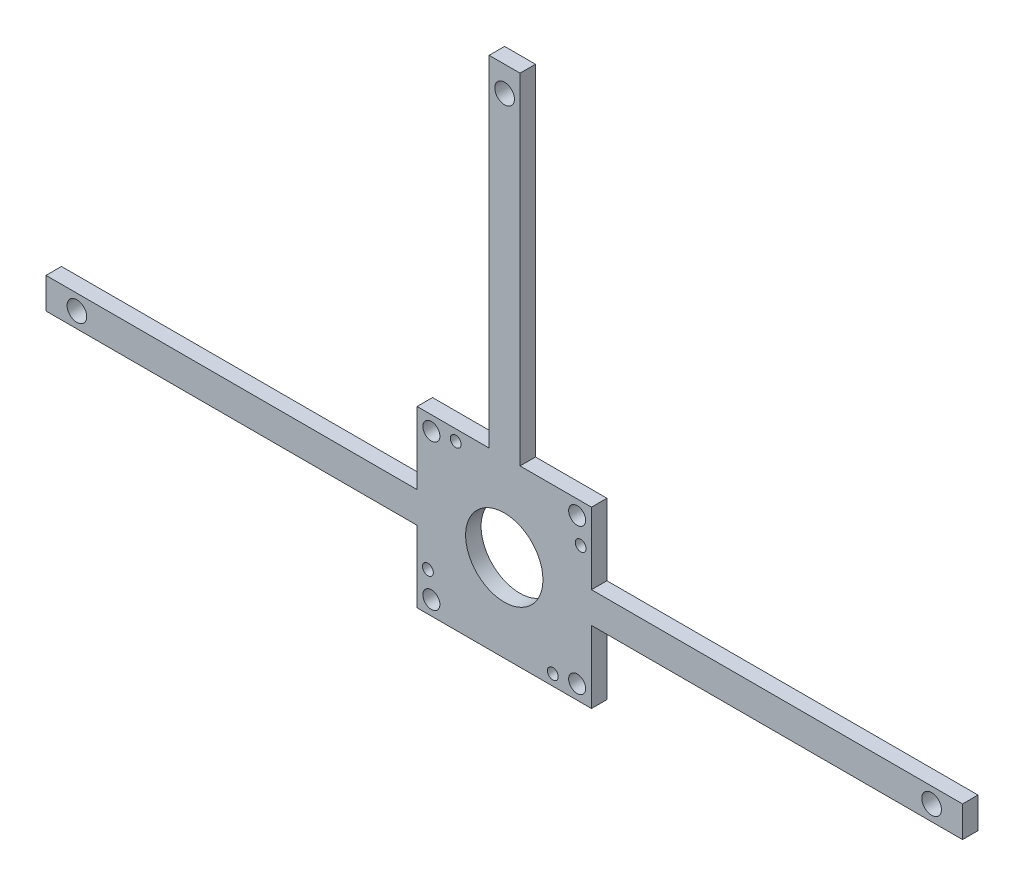
ISO-10303-21;
HEADER;
FILE_DESCRIPTION(('STEP AP214'),'2;1');
FILE_NAME('part.step','',(''),(''),'','','');
FILE_SCHEMA(('AUTOMOTIVE_DESIGN { 1 0 10303 214 1 1 1 1 }'));
ENDSEC;
DATA;
#1=APPLICATION_CONTEXT('core data for automotive mechanical design processes');
#2=APPLICATION_PROTOCOL_DEFINITION('international standard','automotive_design',2000,#1);
#3=PRODUCT_CONTEXT('',#1,'mechanical');
#4=PRODUCT('Part','Part','',(#3));
#5=PRODUCT_RELATED_PRODUCT_CATEGORY('part','',(#4));
#6=PRODUCT_DEFINITION_FORMATION('','',#4);
#7=PRODUCT_DEFINITION_CONTEXT('part definition',#1,'design');
#8=PRODUCT_DEFINITION('design','',#6,#7);
#9=PRODUCT_DEFINITION_SHAPE('','',#8);
#10=(LENGTH_UNIT() NAMED_UNIT(*) SI_UNIT(.MILLI.,.METRE.));
#11=(NAMED_UNIT(*) PLANE_ANGLE_UNIT() SI_UNIT($,.RADIAN.));
#12=(NAMED_UNIT(*) SI_UNIT($,.STERADIAN.) SOLID_ANGLE_UNIT());
#13=UNCERTAINTY_MEASURE_WITH_UNIT(LENGTH_MEASURE(1.E-05),#10,'distance_accuracy_value','');
#14=(GEOMETRIC_REPRESENTATION_CONTEXT(3) GLOBAL_UNCERTAINTY_ASSIGNED_CONTEXT((#13)) GLOBAL_UNIT_ASSIGNED_CONTEXT((#10,
#11,#12)) REPRESENTATION_CONTEXT('',''));
#15=CARTESIAN_POINT('',(0.,0.,0.));
#16=DIRECTION('',(0.,0.,1.));
#17=DIRECTION('',(1.,0.,0.));
#18=AXIS2_PLACEMENT_3D('',#15,#16,#17);
#19=CARTESIAN_POINT('',(0.,0.,5.));
#20=DIRECTION('',(0.,0.,1.));
#21=DIRECTION('',(1.,0.,0.));
#22=AXIS2_PLACEMENT_3D('',#19,#20,#21);
#23=PLANE('',#22);
#24=CARTESIAN_POINT('',(0.101590295881258,70.,5.));
#25=DIRECTION('',(0.,0.,1.));
#26=DIRECTION('',(1.,0.,0.));
#27=AXIS2_PLACEMENT_3D('',#24,#25,#26);
#28=CIRCLE('',#27,3.175);
#29=CARTESIAN_POINT('',(3.27659029588126,70.,5.));
#30=VERTEX_POINT('',#29);
#31=EDGE_CURVE('E370',#30,#30,#28,.T.);
#32=ORIENTED_EDGE('',*,*,#31,.F.);
#33=EDGE_LOOP('',(#32));
#34=FACE_BOUND('',#33,.T.);
#35=CARTESIAN_POINT('',(0.,-60.,5.));
#36=DIRECTION('',(0.,0.,1.));
#37=DIRECTION('',(1.,0.,0.));
#38=AXIS2_PLACEMENT_3D('',#35,#36,#37);
#39=CIRCLE('',#38,12.5);
#40=CARTESIAN_POINT('',(12.5,-60.,5.));
#41=VERTEX_POINT('',#40);
#42=EDGE_CURVE('E383',#41,#41,#39,.T.);
#43=ORIENTED_EDGE('',*,*,#42,.F.);
#44=EDGE_LOOP('',(#43));
#45=FACE_BOUND('',#44,.T.);
#46=CARTESIAN_POINT('',(-138.2,-60.0834875289985,5.));
#47=DIRECTION('',(0.,0.,1.));
#48=DIRECTION('',(1.,0.,0.));
#49=AXIS2_PLACEMENT_3D('',#46,#47,#48);
#50=CIRCLE('',#49,3.175);
#51=CARTESIAN_POINT('',(-135.025,-60.0834875289985,5.));
#52=VERTEX_POINT('',#51);
#53=EDGE_CURVE('E382',#52,#52,#50,.T.);
#54=ORIENTED_EDGE('',*,*,#53,.F.);
#55=EDGE_LOOP('',(#54));
#56=FACE_BOUND('',#55,.T.);
#57=CARTESIAN_POINT('',(138.2,-59.9165124710015,5.));
#58=DIRECTION('',(0.,0.,1.));
#59=DIRECTION('',(1.,0.,0.));
#60=AXIS2_PLACEMENT_3D('',#57,#58,#59);
#61=CIRCLE('',#60,3.175);
#62=CARTESIAN_POINT('',(141.375,-59.9165124710015,5.));
#63=VERTEX_POINT('',#62);
#64=EDGE_CURVE('E376',#63,#63,#61,.T.);
#65=ORIENTED_EDGE('',*,*,#64,.F.);
#66=EDGE_LOOP('',(#65));
#67=FACE_BOUND('',#66,.T.);
#68=CARTESIAN_POINT('',(-24.6999999999999,-75.6999999999999,5.));
#69=DIRECTION('',(0.,0.,1.));
#70=DIRECTION('',(1.,0.,0.));
#71=AXIS2_PLACEMENT_3D('',#68,#69,#70);
#72=CIRCLE('',#71,1.74999999999999);
#73=CARTESIAN_POINT('',(-22.95,-75.6999999999999,5.));
#74=VERTEX_POINT('',#73);
#75=EDGE_CURVE('E393',#74,#74,#72,.T.);
#76=ORIENTED_EDGE('',*,*,#75,.F.);
#77=EDGE_LOOP('',(#76));
#78=FACE_BOUND('',#77,.T.);
#79=CARTESIAN_POINT('',(24.6999999999999,-44.3,5.));
#80=DIRECTION('',(0.,0.,1.));
#81=DIRECTION('',(1.,0.,0.));
#82=AXIS2_PLACEMENT_3D('',#79,#80,#81);
#83=CIRCLE('',#82,1.74777874746956);
#84=CARTESIAN_POINT('',(26.4477787474694,-44.3,5.));
#85=VERTEX_POINT('',#84);
#86=EDGE_CURVE('E405',#85,#85,#83,.T.);
#87=ORIENTED_EDGE('',*,*,#86,.F.);
#88=EDGE_LOOP('',(#87));
#89=FACE_BOUND('',#88,.T.);
#90=CARTESIAN_POINT('',(-23.57,-83.57,5.));
#91=DIRECTION('',(0.,0.,1.));
#92=DIRECTION('',(1.,0.,0.));
#93=AXIS2_PLACEMENT_3D('',#90,#91,#92);
#94=CIRCLE('',#93,2.75);
#95=CARTESIAN_POINT('',(-20.82,-83.57,5.));
#96=VERTEX_POINT('',#95);
#97=EDGE_CURVE('E417',#96,#96,#94,.T.);
#98=ORIENTED_EDGE('',*,*,#97,.F.);
#99=EDGE_LOOP('',(#98));
#100=FACE_BOUND('',#99,.T.);
#101=CARTESIAN_POINT('',(23.57,-36.43,5.));
#102=DIRECTION('',(0.,0.,1.));
#103=DIRECTION('',(1.,0.,0.));
#104=AXIS2_PLACEMENT_3D('',#101,#102,#103);
#105=CIRCLE('',#104,2.75);
#106=CARTESIAN_POINT('',(26.32,-36.43,5.));
#107=VERTEX_POINT('',#106);
#108=EDGE_CURVE('E429',#107,#107,#105,.T.);
#109=ORIENTED_EDGE('',*,*,#108,.F.);
#110=EDGE_LOOP('',(#109));
#111=FACE_BOUND('',#110,.T.);
#112=DIRECTION('',(-1.,0.,0.));
#113=VECTOR('',#112,1.);
#114=CARTESIAN_POINT('',(5.10159029588126,-31.8,5.));
#115=LINE('',#114,#113);
#116=CARTESIAN_POINT('',(28.2,-31.8,5.));
#117=VERTEX_POINT('',#116);
#118=CARTESIAN_POINT('',(5.10159029588126,-31.8,5.));
#119=VERTEX_POINT('',#118);
#120=EDGE_CURVE('E210',#117,#119,#115,.T.);
#121=ORIENTED_EDGE('',*,*,#120,.T.);
#122=DIRECTION('',(0.,1.,0.));
#123=VECTOR('',#122,1.);
#124=CARTESIAN_POINT('',(5.10159029588126,-31.8,5.));
#125=LINE('',#124,#123);
#126=CARTESIAN_POINT('',(5.10159029588126,78.2,5.));
#127=VERTEX_POINT('',#126);
#128=EDGE_CURVE('E118',#119,#127,#125,.T.);
#129=ORIENTED_EDGE('',*,*,#128,.T.);
#130=DIRECTION('',(-1.,0.,0.));
#131=VECTOR('',#130,1.);
#132=CARTESIAN_POINT('',(5.10159029588126,78.2,5.));
#133=LINE('',#132,#131);
#134=CARTESIAN_POINT('',(-4.89840970411874,78.2,5.));
#135=VERTEX_POINT('',#134);
#136=EDGE_CURVE('E249',#127,#135,#133,.T.);
#137=ORIENTED_EDGE('',*,*,#136,.T.);
#138=DIRECTION('',(0.,-1.,0.));
#139=VECTOR('',#138,1.);
#140=CARTESIAN_POINT('',(-4.89840970411874,-31.8,5.));
#141=LINE('',#140,#139);
#142=CARTESIAN_POINT('',(-4.89840970411874,-31.8,5.));
#143=VERTEX_POINT('',#142);
#144=EDGE_CURVE('E268',#135,#143,#141,.T.);
#145=ORIENTED_EDGE('',*,*,#144,.T.);
#146=DIRECTION('',(-1.,0.,0.));
#147=VECTOR('',#146,1.);
#148=CARTESIAN_POINT('',(-28.2,-31.8,5.));
#149=LINE('',#148,#147);
#150=CARTESIAN_POINT('',(-28.2,-31.8,5.));
#151=VERTEX_POINT('',#150);
#152=EDGE_CURVE('E265',#143,#151,#149,.T.);
#153=ORIENTED_EDGE('',*,*,#152,.T.);
#154=DIRECTION('',(0.,-1.,0.));
#155=VECTOR('',#154,1.);
#156=CARTESIAN_POINT('',(-28.2,-55.0834875289985,5.));
#157=LINE('',#156,#155);
#158=CARTESIAN_POINT('',(-28.2,-55.0834875289985,5.));
#159=VERTEX_POINT('',#158);
#160=EDGE_CURVE('E267',#151,#159,#157,.T.);
#161=ORIENTED_EDGE('',*,*,#160,.T.);
#162=DIRECTION('',(-1.,0.,0.));
#163=VECTOR('',#162,1.);
#164=CARTESIAN_POINT('',(-148.2,-55.0834875289985,5.));
#165=LINE('',#164,#163);
#166=CARTESIAN_POINT('',(-148.2,-55.0834875289985,5.));
#167=VERTEX_POINT('',#166);
#168=EDGE_CURVE('E270',#159,#167,#165,.T.);
#169=ORIENTED_EDGE('',*,*,#168,.T.);
#170=DIRECTION('',(0.,-1.,0.));
#171=VECTOR('',#170,1.);
#172=CARTESIAN_POINT('',(-148.2,-55.0834875289985,5.));
#173=LINE('',#172,#171);
#174=CARTESIAN_POINT('',(-148.2,-65.0834875289985,5.));
#175=VERTEX_POINT('',#174);
#176=EDGE_CURVE('E276',#167,#175,#173,.T.);
#177=ORIENTED_EDGE('',*,*,#176,.T.);
#178=DIRECTION('',(1.,0.,0.));
#179=VECTOR('',#178,1.);
#180=CARTESIAN_POINT('',(-148.2,-65.0834875289985,5.));
#181=LINE('',#180,#179);
#182=CARTESIAN_POINT('',(-28.2,-65.0834875289985,5.));
#183=VERTEX_POINT('',#182);
#184=EDGE_CURVE('E278',#175,#183,#181,.T.);
#185=ORIENTED_EDGE('',*,*,#184,.T.);
#186=DIRECTION('',(0.,-1.,0.));
#187=VECTOR('',#186,1.);
#188=CARTESIAN_POINT('',(-28.2,-88.2,5.));
#189=LINE('',#188,#187);
#190=CARTESIAN_POINT('',(-28.2,-88.2,5.));
#191=VERTEX_POINT('',#190);
#192=EDGE_CURVE('E280',#183,#191,#189,.T.);
#193=ORIENTED_EDGE('',*,*,#192,.T.);
#194=DIRECTION('',(1.,0.,0.));
#195=VECTOR('',#194,1.);
#196=CARTESIAN_POINT('',(-28.2,-88.2,5.));
#197=LINE('',#196,#195);
#198=CARTESIAN_POINT('',(28.2,-88.2,5.));
#199=VERTEX_POINT('',#198);
#200=EDGE_CURVE('E282',#191,#199,#197,.T.);
#201=ORIENTED_EDGE('',*,*,#200,.T.);
#202=DIRECTION('',(0.,1.,0.));
#203=VECTOR('',#202,1.);
#204=CARTESIAN_POINT('',(28.2,-88.2,5.));
#205=LINE('',#204,#203);
#206=CARTESIAN_POINT('',(28.2,-64.9165124710015,5.));
#207=VERTEX_POINT('',#206);
#208=EDGE_CURVE('E284',#199,#207,#205,.T.);
#209=ORIENTED_EDGE('',*,*,#208,.T.);
#210=DIRECTION('',(1.,0.,0.));
#211=VECTOR('',#210,1.);
#212=CARTESIAN_POINT('',(28.2,-64.9165124710015,5.));
#213=LINE('',#212,#211);
#214=CARTESIAN_POINT('',(148.2,-64.9165124710015,5.));
#215=VERTEX_POINT('',#214);
#216=EDGE_CURVE('E161',#207,#215,#213,.T.);
#217=ORIENTED_EDGE('',*,*,#216,.T.);
#218=DIRECTION('',(0.,1.,0.));
#219=VECTOR('',#218,1.);
#220=CARTESIAN_POINT('',(148.2,-54.9165124710015,5.));
#221=LINE('',#220,#219);
#222=CARTESIAN_POINT('',(148.2,-54.9165124710015,5.));
#223=VERTEX_POINT('',#222);
#224=EDGE_CURVE('E155',#215,#223,#221,.T.);
#225=ORIENTED_EDGE('',*,*,#224,.T.);
#226=DIRECTION('',(-1.,0.,0.));
#227=VECTOR('',#226,1.);
#228=CARTESIAN_POINT('',(28.2,-54.9165124710015,5.));
#229=LINE('',#228,#227);
#230=CARTESIAN_POINT('',(28.2,-54.9165124710015,5.));
#231=VERTEX_POINT('',#230);
#232=EDGE_CURVE('E159',#223,#231,#229,.T.);
#233=ORIENTED_EDGE('',*,*,#232,.T.);
#234=DIRECTION('',(0.,1.,0.));
#235=VECTOR('',#234,1.);
#236=CARTESIAN_POINT('',(28.2,-54.9165124710015,5.));
#237=LINE('',#236,#235);
#238=EDGE_CURVE('E51',#231,#117,#237,.T.);
#239=ORIENTED_EDGE('',*,*,#238,.T.);
#240=EDGE_LOOP('',(#121,#129,#137,#145,#153,#161,#169,#177,#185,#193,#201,#209,#217,#225,#233,#239));
#241=FACE_BOUND('',#240,.T.);
#242=CARTESIAN_POINT('',(-23.57,-36.43,5.));
#243=DIRECTION('',(0.,0.,1.));
#244=DIRECTION('',(1.,0.,0.));
#245=AXIS2_PLACEMENT_3D('',#242,#243,#244);
#246=CIRCLE('',#245,2.75);
#247=CARTESIAN_POINT('',(-20.82,-36.43,5.));
#248=VERTEX_POINT('',#247);
#249=EDGE_CURVE('E183',#248,#248,#246,.T.);
#250=ORIENTED_EDGE('',*,*,#249,.F.);
#251=EDGE_LOOP('',(#250));
#252=FACE_BOUND('',#251,.T.);
#253=CARTESIAN_POINT('',(23.57,-83.57,5.));
#254=DIRECTION('',(0.,0.,1.));
#255=DIRECTION('',(1.,0.,0.));
#256=AXIS2_PLACEMENT_3D('',#253,#254,#255);
#257=CIRCLE('',#256,2.75);
#258=CARTESIAN_POINT('',(26.32,-83.57,5.));
#259=VERTEX_POINT('',#258);
#260=EDGE_CURVE('E423',#259,#259,#257,.T.);
#261=ORIENTED_EDGE('',*,*,#260,.F.);
#262=EDGE_LOOP('',(#261));
#263=FACE_BOUND('',#262,.T.);
#264=CARTESIAN_POINT('',(-15.7,-35.3,5.));
#265=DIRECTION('',(0.,0.,1.));
#266=DIRECTION('',(1.,0.,0.));
#267=AXIS2_PLACEMENT_3D('',#264,#265,#266);
#268=CIRCLE('',#267,1.74999999999999);
#269=CARTESIAN_POINT('',(-13.95,-35.3,5.));
#270=VERTEX_POINT('',#269);
#271=EDGE_CURVE('E411',#270,#270,#268,.T.);
#272=ORIENTED_EDGE('',*,*,#271,.F.);
#273=EDGE_LOOP('',(#272));
#274=FACE_BOUND('',#273,.T.);
#275=CARTESIAN_POINT('',(15.6999999999999,-84.6999999999998,5.));
#276=DIRECTION('',(0.,0.,1.));
#277=DIRECTION('',(1.,0.,0.));
#278=AXIS2_PLACEMENT_3D('',#275,#276,#277);
#279=CIRCLE('',#278,1.74999999999999);
#280=CARTESIAN_POINT('',(17.4499999999999,-84.6999999999998,5.));
#281=VERTEX_POINT('',#280);
#282=EDGE_CURVE('E399',#281,#281,#279,.T.);
#283=ORIENTED_EDGE('',*,*,#282,.F.);
#284=EDGE_LOOP('',(#283));
#285=FACE_BOUND('',#284,.T.);
#286=ADVANCED_FACE('F34',(#34,#45,#56,#67,#78,#89,#100,#111,#241,#252,#263,#274,#285),#23,.T.);
#287=CARTESIAN_POINT('',(0.,0.,0.));
#288=DIRECTION('',(0.,0.,1.));
#289=DIRECTION('',(1.,0.,0.));
#290=AXIS2_PLACEMENT_3D('',#287,#288,#289);
#291=PLANE('',#290);
#292=CARTESIAN_POINT('',(0.101590295881258,70.,0.));
#293=DIRECTION('',(0.,0.,1.));
#294=DIRECTION('',(1.,0.,0.));
#295=AXIS2_PLACEMENT_3D('',#292,#293,#294);
#296=CIRCLE('',#295,3.175);
#297=CARTESIAN_POINT('',(3.27659029588126,70.,0.));
#298=VERTEX_POINT('',#297);
#299=EDGE_CURVE('E368',#298,#298,#296,.T.);
#300=ORIENTED_EDGE('',*,*,#299,.T.);
#301=EDGE_LOOP('',(#300));
#302=FACE_BOUND('',#301,.T.);
#303=CARTESIAN_POINT('',(0.,-60.,0.));
#304=DIRECTION('',(0.,0.,1.));
#305=DIRECTION('',(1.,0.,0.));
#306=AXIS2_PLACEMENT_3D('',#303,#304,#305);
#307=CIRCLE('',#306,12.5);
#308=CARTESIAN_POINT('',(12.5,-60.,0.));
#309=VERTEX_POINT('',#308);
#310=EDGE_CURVE('E379',#309,#309,#307,.T.);
#311=ORIENTED_EDGE('',*,*,#310,.T.);
#312=EDGE_LOOP('',(#311));
#313=FACE_BOUND('',#312,.T.);
#314=CARTESIAN_POINT('',(-138.2,-60.0834875289985,0.));
#315=DIRECTION('',(0.,0.,1.));
#316=DIRECTION('',(1.,0.,0.));
#317=AXIS2_PLACEMENT_3D('',#314,#315,#316);
#318=CIRCLE('',#317,3.175);
#319=CARTESIAN_POINT('',(-135.025,-60.0834875289985,0.));
#320=VERTEX_POINT('',#319);
#321=EDGE_CURVE('E388',#320,#320,#318,.T.);
#322=ORIENTED_EDGE('',*,*,#321,.T.);
#323=EDGE_LOOP('',(#322));
#324=FACE_BOUND('',#323,.T.);
#325=CARTESIAN_POINT('',(138.2,-59.9165124710015,0.));
#326=DIRECTION('',(0.,0.,1.));
#327=DIRECTION('',(1.,0.,0.));
#328=AXIS2_PLACEMENT_3D('',#325,#326,#327);
#329=CIRCLE('',#328,3.175);
#330=CARTESIAN_POINT('',(141.375,-59.9165124710015,0.));
#331=VERTEX_POINT('',#330);
#332=EDGE_CURVE('E371',#331,#331,#329,.T.);
#333=ORIENTED_EDGE('',*,*,#332,.T.);
#334=EDGE_LOOP('',(#333));
#335=FACE_BOUND('',#334,.T.);
#336=DIRECTION('',(-1.,0.,0.));
#337=VECTOR('',#336,1.);
#338=CARTESIAN_POINT('',(5.10159029588126,-31.8,0.));
#339=LINE('',#338,#337);
#340=CARTESIAN_POINT('',(28.2,-31.8,0.));
#341=VERTEX_POINT('',#340);
#342=CARTESIAN_POINT('',(5.10159029588126,-31.8,0.));
#343=VERTEX_POINT('',#342);
#344=EDGE_CURVE('E179',#341,#343,#339,.T.);
#345=ORIENTED_EDGE('',*,*,#344,.F.);
#346=DIRECTION('',(0.,1.,0.));
#347=VECTOR('',#346,1.);
#348=CARTESIAN_POINT('',(28.2,-54.9165124710015,0.));
#349=LINE('',#348,#347);
#350=CARTESIAN_POINT('',(28.2,-54.9165124710015,0.));
#351=VERTEX_POINT('',#350);
#352=EDGE_CURVE('E110',#351,#341,#349,.T.);
#353=ORIENTED_EDGE('',*,*,#352,.F.);
#354=DIRECTION('',(-1.,0.,0.));
#355=VECTOR('',#354,1.);
#356=CARTESIAN_POINT('',(28.2,-54.9165124710015,0.));
#357=LINE('',#356,#355);
#358=CARTESIAN_POINT('',(148.2,-54.9165124710015,0.));
#359=VERTEX_POINT('',#358);
#360=EDGE_CURVE('E104',#359,#351,#357,.T.);
#361=ORIENTED_EDGE('',*,*,#360,.F.);
#362=DIRECTION('',(0.,1.,0.));
#363=VECTOR('',#362,1.);
#364=CARTESIAN_POINT('',(148.2,-54.9165124710015,0.));
#365=LINE('',#364,#363);
#366=CARTESIAN_POINT('',(148.2,-64.9165124710015,0.));
#367=VERTEX_POINT('',#366);
#368=EDGE_CURVE('E169',#367,#359,#365,.T.);
#369=ORIENTED_EDGE('',*,*,#368,.F.);
#370=DIRECTION('',(1.,0.,0.));
#371=VECTOR('',#370,1.);
#372=CARTESIAN_POINT('',(28.2,-64.9165124710015,0.));
#373=LINE('',#372,#371);
#374=CARTESIAN_POINT('',(28.2,-64.9165124710015,0.));
#375=VERTEX_POINT('',#374);
#376=EDGE_CURVE('E205',#375,#367,#373,.T.);
#377=ORIENTED_EDGE('',*,*,#376,.F.);
#378=DIRECTION('',(0.,1.,0.));
#379=VECTOR('',#378,1.);
#380=CARTESIAN_POINT('',(28.2,-88.2,0.));
#381=LINE('',#380,#379);
#382=CARTESIAN_POINT('',(28.2,-88.2,0.));
#383=VERTEX_POINT('',#382);
#384=EDGE_CURVE('E203',#383,#375,#381,.T.);
#385=ORIENTED_EDGE('',*,*,#384,.F.);
#386=DIRECTION('',(1.,0.,0.));
#387=VECTOR('',#386,1.);
#388=CARTESIAN_POINT('',(-28.2,-88.2,0.));
#389=LINE('',#388,#387);
#390=CARTESIAN_POINT('',(-28.2,-88.2,0.));
#391=VERTEX_POINT('',#390);
#392=EDGE_CURVE('E201',#391,#383,#389,.T.);
#393=ORIENTED_EDGE('',*,*,#392,.F.);
#394=DIRECTION('',(0.,-1.,0.));
#395=VECTOR('',#394,1.);
#396=CARTESIAN_POINT('',(-28.2,-88.2,0.));
#397=LINE('',#396,#395);
#398=CARTESIAN_POINT('',(-28.2,-65.0834875289985,0.));
#399=VERTEX_POINT('',#398);
#400=EDGE_CURVE('E199',#399,#391,#397,.T.);
#401=ORIENTED_EDGE('',*,*,#400,.F.);
#402=DIRECTION('',(1.,0.,0.));
#403=VECTOR('',#402,1.);
#404=CARTESIAN_POINT('',(-148.2,-65.0834875289985,0.));
#405=LINE('',#404,#403);
#406=CARTESIAN_POINT('',(-148.2,-65.0834875289985,0.));
#407=VERTEX_POINT('',#406);
#408=EDGE_CURVE('E197',#407,#399,#405,.T.);
#409=ORIENTED_EDGE('',*,*,#408,.F.);
#410=DIRECTION('',(0.,-1.,0.));
#411=VECTOR('',#410,1.);
#412=CARTESIAN_POINT('',(-148.2,-55.0834875289985,0.));
#413=LINE('',#412,#411);
#414=CARTESIAN_POINT('',(-148.2,-55.0834875289985,0.));
#415=VERTEX_POINT('',#414);
#416=EDGE_CURVE('E195',#415,#407,#413,.T.);
#417=ORIENTED_EDGE('',*,*,#416,.F.);
#418=DIRECTION('',(-1.,0.,0.));
#419=VECTOR('',#418,1.);
#420=CARTESIAN_POINT('',(-148.2,-55.0834875289985,0.));
#421=LINE('',#420,#419);
#422=CARTESIAN_POINT('',(-28.2,-55.0834875289985,0.));
#423=VERTEX_POINT('',#422);
#424=EDGE_CURVE('E193',#423,#415,#421,.T.);
#425=ORIENTED_EDGE('',*,*,#424,.F.);
#426=DIRECTION('',(0.,-1.,0.));
#427=VECTOR('',#426,1.);
#428=CARTESIAN_POINT('',(-28.2,-55.0834875289985,0.));
#429=LINE('',#428,#427);
#430=CARTESIAN_POINT('',(-28.2,-31.8,0.));
#431=VERTEX_POINT('',#430);
#432=EDGE_CURVE('E191',#431,#423,#429,.T.);
#433=ORIENTED_EDGE('',*,*,#432,.F.);
#434=DIRECTION('',(-1.,0.,0.));
#435=VECTOR('',#434,1.);
#436=CARTESIAN_POINT('',(-28.2,-31.8,0.));
#437=LINE('',#436,#435);
#438=CARTESIAN_POINT('',(-4.89840970411874,-31.8,0.));
#439=VERTEX_POINT('',#438);
#440=EDGE_CURVE('E189',#439,#431,#437,.T.);
#441=ORIENTED_EDGE('',*,*,#440,.F.);
#442=DIRECTION('',(0.,-1.,0.));
#443=VECTOR('',#442,1.);
#444=CARTESIAN_POINT('',(-4.89840970411874,-31.8,0.));
#445=LINE('',#444,#443);
#446=CARTESIAN_POINT('',(-4.89840970411874,78.2,0.));
#447=VERTEX_POINT('',#446);
#448=EDGE_CURVE('E187',#447,#439,#445,.T.);
#449=ORIENTED_EDGE('',*,*,#448,.F.);
#450=DIRECTION('',(-1.,0.,0.));
#451=VECTOR('',#450,1.);
#452=CARTESIAN_POINT('',(5.10159029588126,78.2,0.));
#453=LINE('',#452,#451);
#454=CARTESIAN_POINT('',(5.10159029588126,78.2,0.));
#455=VERTEX_POINT('',#454);
#456=EDGE_CURVE('E185',#455,#447,#453,.T.);
#457=ORIENTED_EDGE('',*,*,#456,.F.);
#458=DIRECTION('',(0.,1.,0.));
#459=VECTOR('',#458,1.);
#460=CARTESIAN_POINT('',(5.10159029588126,-31.8,0.));
#461=LINE('',#460,#459);
#462=EDGE_CURVE('E182',#343,#455,#461,.T.);
#463=ORIENTED_EDGE('',*,*,#462,.F.);
#464=EDGE_LOOP('',(#345,#353,#361,#369,#377,#385,#393,#401,#409,#417,#425,#433,#441,#449,#457,#463));
#465=FACE_BOUND('',#464,.T.);
#466=CARTESIAN_POINT('',(-23.57,-36.43,0.));
#467=DIRECTION('',(0.,0.,1.));
#468=DIRECTION('',(1.,0.,0.));
#469=AXIS2_PLACEMENT_3D('',#466,#467,#468);
#470=CIRCLE('',#469,2.75);
#471=CARTESIAN_POINT('',(-20.82,-36.43,0.));
#472=VERTEX_POINT('',#471);
#473=EDGE_CURVE('E432',#472,#472,#470,.T.);
#474=ORIENTED_EDGE('',*,*,#473,.T.);
#475=EDGE_LOOP('',(#474));
#476=FACE_BOUND('',#475,.T.);
#477=CARTESIAN_POINT('',(23.57,-36.43,0.));
#478=DIRECTION('',(0.,0.,1.));
#479=DIRECTION('',(1.,0.,0.));
#480=AXIS2_PLACEMENT_3D('',#477,#478,#479);
#481=CIRCLE('',#480,2.75);
#482=CARTESIAN_POINT('',(26.32,-36.43,0.));
#483=VERTEX_POINT('',#482);
#484=EDGE_CURVE('E426',#483,#483,#481,.T.);
#485=ORIENTED_EDGE('',*,*,#484,.T.);
#486=EDGE_LOOP('',(#485));
#487=FACE_BOUND('',#486,.T.);
#488=CARTESIAN_POINT('',(23.57,-83.57,0.));
#489=DIRECTION('',(0.,0.,1.));
#490=DIRECTION('',(1.,0.,0.));
#491=AXIS2_PLACEMENT_3D('',#488,#489,#490);
#492=CIRCLE('',#491,2.75);
#493=CARTESIAN_POINT('',(26.32,-83.57,0.));
#494=VERTEX_POINT('',#493);
#495=EDGE_CURVE('E420',#494,#494,#492,.T.);
#496=ORIENTED_EDGE('',*,*,#495,.T.);
#497=EDGE_LOOP('',(#496));
#498=FACE_BOUND('',#497,.T.);
#499=CARTESIAN_POINT('',(-23.57,-83.57,0.));
#500=DIRECTION('',(0.,0.,1.));
#501=DIRECTION('',(1.,0.,0.));
#502=AXIS2_PLACEMENT_3D('',#499,#500,#501);
#503=CIRCLE('',#502,2.75);
#504=CARTESIAN_POINT('',(-20.82,-83.57,0.));
#505=VERTEX_POINT('',#504);
#506=EDGE_CURVE('E414',#505,#505,#503,.T.);
#507=ORIENTED_EDGE('',*,*,#506,.T.);
#508=EDGE_LOOP('',(#507));
#509=FACE_BOUND('',#508,.T.);
#510=CARTESIAN_POINT('',(-15.7,-35.3,0.));
#511=DIRECTION('',(0.,0.,1.));
#512=DIRECTION('',(1.,0.,0.));
#513=AXIS2_PLACEMENT_3D('',#510,#511,#512);
#514=CIRCLE('',#513,1.74999999999999);
#515=CARTESIAN_POINT('',(-13.95,-35.3,0.));
#516=VERTEX_POINT('',#515);
#517=EDGE_CURVE('E408',#516,#516,#514,.T.);
#518=ORIENTED_EDGE('',*,*,#517,.T.);
#519=EDGE_LOOP('',(#518));
#520=FACE_BOUND('',#519,.T.);
#521=CARTESIAN_POINT('',(24.6999999999999,-44.3,0.));
#522=DIRECTION('',(0.,0.,1.));
#523=DIRECTION('',(1.,0.,0.));
#524=AXIS2_PLACEMENT_3D('',#521,#522,#523);
#525=CIRCLE('',#524,1.74777874746956);
#526=CARTESIAN_POINT('',(26.4477787474694,-44.3,0.));
#527=VERTEX_POINT('',#526);
#528=EDGE_CURVE('E402',#527,#527,#525,.T.);
#529=ORIENTED_EDGE('',*,*,#528,.T.);
#530=EDGE_LOOP('',(#529));
#531=FACE_BOUND('',#530,.T.);
#532=CARTESIAN_POINT('',(15.6999999999999,-84.6999999999998,0.));
#533=DIRECTION('',(0.,0.,1.));
#534=DIRECTION('',(1.,0.,0.));
#535=AXIS2_PLACEMENT_3D('',#532,#533,#534);
#536=CIRCLE('',#535,1.74999999999999);
#537=CARTESIAN_POINT('',(17.4499999999999,-84.6999999999998,0.));
#538=VERTEX_POINT('',#537);
#539=EDGE_CURVE('E396',#538,#538,#536,.T.);
#540=ORIENTED_EDGE('',*,*,#539,.T.);
#541=EDGE_LOOP('',(#540));
#542=FACE_BOUND('',#541,.T.);
#543=CARTESIAN_POINT('',(-24.6999999999999,-75.6999999999999,0.));
#544=DIRECTION('',(0.,0.,1.));
#545=DIRECTION('',(1.,0.,0.));
#546=AXIS2_PLACEMENT_3D('',#543,#544,#545);
#547=CIRCLE('',#546,1.74999999999999);
#548=CARTESIAN_POINT('',(-22.95,-75.6999999999999,0.));
#549=VERTEX_POINT('',#548);
#550=EDGE_CURVE('E373',#549,#549,#547,.T.);
#551=ORIENTED_EDGE('',*,*,#550,.T.);
#552=EDGE_LOOP('',(#551));
#553=FACE_BOUND('',#552,.T.);
#554=ADVANCED_FACE('F253',(#302,#313,#324,#335,#465,#476,#487,#498,#509,#520,#531,#542,#553),
#291,.F.);
#555=CARTESIAN_POINT('',(5.10159029588126,-31.8,5.));
#556=DIRECTION('',(0.,-1.,0.));
#557=DIRECTION('',(0.,0.,-1.));
#558=AXIS2_PLACEMENT_3D('',#555,#556,#557);
#559=PLANE('',#558);
#560=ORIENTED_EDGE('',*,*,#344,.T.);
#561=DIRECTION('',(0.,0.,-1.));
#562=VECTOR('',#561,1.);
#563=CARTESIAN_POINT('',(5.10159029588126,-31.8,5.));
#564=LINE('',#563,#562);
#565=EDGE_CURVE('E11',#119,#343,#564,.T.);
#566=ORIENTED_EDGE('',*,*,#565,.F.);
#567=ORIENTED_EDGE('',*,*,#120,.F.);
#568=DIRECTION('',(0.,0.,-1.));
#569=VECTOR('',#568,1.);
#570=CARTESIAN_POINT('',(28.2,-31.8,5.));
#571=LINE('',#570,#569);
#572=EDGE_CURVE('E175',#117,#341,#571,.T.);
#573=ORIENTED_EDGE('',*,*,#572,.T.);
#574=EDGE_LOOP('',(#560,#566,#567,#573));
#575=FACE_BOUND('',#574,.T.);
#576=ADVANCED_FACE('F36',(#575),#559,.F.);
#577=CARTESIAN_POINT('',(5.10159029588126,-31.8,5.));
#578=DIRECTION('',(-1.,0.,0.));
#579=DIRECTION('',(0.,0.,1.));
#580=AXIS2_PLACEMENT_3D('',#577,#578,#579);
#581=PLANE('',#580);
#582=ORIENTED_EDGE('',*,*,#462,.T.);
#583=DIRECTION('',(0.,0.,-1.));
#584=VECTOR('',#583,1.);
#585=CARTESIAN_POINT('',(5.10159029588126,78.2,5.));
#586=LINE('',#585,#584);
#587=EDGE_CURVE('E43',#127,#455,#586,.T.);
#588=ORIENTED_EDGE('',*,*,#587,.F.);
#589=ORIENTED_EDGE('',*,*,#128,.F.);
#590=ORIENTED_EDGE('',*,*,#565,.T.);
#591=EDGE_LOOP('',(#582,#588,#589,#590));
#592=FACE_BOUND('',#591,.T.);
#593=ADVANCED_FACE('F656',(#592),#581,.F.);
#594=CARTESIAN_POINT('',(5.10159029588126,78.2,5.));
#595=DIRECTION('',(0.,-1.,0.));
#596=DIRECTION('',(0.,0.,-1.));
#597=AXIS2_PLACEMENT_3D('',#594,#595,#596);
#598=PLANE('',#597);
#599=ORIENTED_EDGE('',*,*,#456,.T.);
#600=DIRECTION('',(0.,0.,-1.));
#601=VECTOR('',#600,1.);
#602=CARTESIAN_POINT('',(-4.89840970411874,78.2,5.));
#603=LINE('',#602,#601);
#604=EDGE_CURVE('E241',#135,#447,#603,.T.);
#605=ORIENTED_EDGE('',*,*,#604,.F.);
#606=ORIENTED_EDGE('',*,*,#136,.F.);
#607=ORIENTED_EDGE('',*,*,#587,.T.);
#608=EDGE_LOOP('',(#599,#605,#606,#607));
#609=FACE_BOUND('',#608,.T.);
#610=ADVANCED_FACE('F247',(#609),#598,.F.);
#611=CARTESIAN_POINT('',(-4.89840970411874,-31.8,5.));
#612=DIRECTION('',(1.,0.,0.));
#613=DIRECTION('',(0.,0.,-1.));
#614=AXIS2_PLACEMENT_3D('',#611,#612,#613);
#615=PLANE('',#614);
#616=ORIENTED_EDGE('',*,*,#448,.T.);
#617=DIRECTION('',(0.,0.,-1.));
#618=VECTOR('',#617,1.);
#619=CARTESIAN_POINT('',(-4.89840970411874,-31.8,5.));
#620=LINE('',#619,#618);
#621=EDGE_CURVE('E238',#143,#439,#620,.T.);
#622=ORIENTED_EDGE('',*,*,#621,.F.);
#623=ORIENTED_EDGE('',*,*,#144,.F.);
#624=ORIENTED_EDGE('',*,*,#604,.T.);
#625=EDGE_LOOP('',(#616,#622,#623,#624));
#626=FACE_BOUND('',#625,.T.);
#627=ADVANCED_FACE('F259',(#626),#615,.F.);
#628=CARTESIAN_POINT('',(-28.2,-31.8,5.));
#629=DIRECTION('',(0.,-1.,0.));
#630=DIRECTION('',(0.,0.,-1.));
#631=AXIS2_PLACEMENT_3D('',#628,#629,#630);
#632=PLANE('',#631);
#633=ORIENTED_EDGE('',*,*,#440,.T.);
#634=DIRECTION('',(0.,0.,-1.));
#635=VECTOR('',#634,1.);
#636=CARTESIAN_POINT('',(-28.2,-31.8,5.));
#637=LINE('',#636,#635);
#638=EDGE_CURVE('E235',#151,#431,#637,.T.);
#639=ORIENTED_EDGE('',*,*,#638,.F.);
#640=ORIENTED_EDGE('',*,*,#152,.F.);
#641=ORIENTED_EDGE('',*,*,#621,.T.);
#642=EDGE_LOOP('',(#633,#639,#640,#641));
#643=FACE_BOUND('',#642,.T.);
#644=ADVANCED_FACE('F263',(#643),#632,.F.);
#645=CARTESIAN_POINT('',(-28.2,-55.0834875289985,5.));
#646=DIRECTION('',(1.,0.,0.));
#647=DIRECTION('',(0.,0.,-1.));
#648=AXIS2_PLACEMENT_3D('',#645,#646,#647);
#649=PLANE('',#648);
#650=ORIENTED_EDGE('',*,*,#432,.T.);
#651=DIRECTION('',(0.,0.,-1.));
#652=VECTOR('',#651,1.);
#653=CARTESIAN_POINT('',(-28.2,-55.0834875289985,5.));
#654=LINE('',#653,#652);
#655=EDGE_CURVE('E232',#159,#423,#654,.T.);
#656=ORIENTED_EDGE('',*,*,#655,.F.);
#657=ORIENTED_EDGE('',*,*,#160,.F.);
#658=ORIENTED_EDGE('',*,*,#638,.T.);
#659=EDGE_LOOP('',(#650,#656,#657,#658));
#660=FACE_BOUND('',#659,.T.);
#661=ADVANCED_FACE('F621',(#660),#649,.F.);
#662=CARTESIAN_POINT('',(-148.2,-55.0834875289985,5.));
#663=DIRECTION('',(0.,-1.,0.));
#664=DIRECTION('',(0.,0.,-1.));
#665=AXIS2_PLACEMENT_3D('',#662,#663,#664);
#666=PLANE('',#665);
#667=ORIENTED_EDGE('',*,*,#424,.T.);
#668=DIRECTION('',(0.,0.,-1.));
#669=VECTOR('',#668,1.);
#670=CARTESIAN_POINT('',(-148.2,-55.0834875289985,5.));
#671=LINE('',#670,#669);
#672=EDGE_CURVE('E229',#167,#415,#671,.T.);
#673=ORIENTED_EDGE('',*,*,#672,.F.);
#674=ORIENTED_EDGE('',*,*,#168,.F.);
#675=ORIENTED_EDGE('',*,*,#655,.T.);
#676=EDGE_LOOP('',(#667,#673,#674,#675));
#677=FACE_BOUND('',#676,.T.);
#678=ADVANCED_FACE('F611',(#677),#666,.F.);
#679=CARTESIAN_POINT('',(-148.2,-55.0834875289985,5.));
#680=DIRECTION('',(1.,0.,0.));
#681=DIRECTION('',(0.,0.,-1.));
#682=AXIS2_PLACEMENT_3D('',#679,#680,#681);
#683=PLANE('',#682);
#684=ORIENTED_EDGE('',*,*,#416,.T.);
#685=DIRECTION('',(0.,0.,-1.));
#686=VECTOR('',#685,1.);
#687=CARTESIAN_POINT('',(-148.2,-65.0834875289985,5.));
#688=LINE('',#687,#686);
#689=EDGE_CURVE('E226',#175,#407,#688,.T.);
#690=ORIENTED_EDGE('',*,*,#689,.F.);
#691=ORIENTED_EDGE('',*,*,#176,.F.);
#692=ORIENTED_EDGE('',*,*,#672,.T.);
#693=EDGE_LOOP('',(#684,#690,#691,#692));
#694=FACE_BOUND('',#693,.T.);
#695=ADVANCED_FACE('F601',(#694),#683,.F.);
#696=CARTESIAN_POINT('',(-148.2,-65.0834875289985,5.));
#697=DIRECTION('',(0.,1.,0.));
#698=DIRECTION('',(0.,0.,1.));
#699=AXIS2_PLACEMENT_3D('',#696,#697,#698);
#700=PLANE('',#699);
#701=ORIENTED_EDGE('',*,*,#408,.T.);
#702=DIRECTION('',(0.,0.,-1.));
#703=VECTOR('',#702,1.);
#704=CARTESIAN_POINT('',(-28.2,-65.0834875289985,5.));
#705=LINE('',#704,#703);
#706=EDGE_CURVE('E223',#183,#399,#705,.T.);
#707=ORIENTED_EDGE('',*,*,#706,.F.);
#708=ORIENTED_EDGE('',*,*,#184,.F.);
#709=ORIENTED_EDGE('',*,*,#689,.T.);
#710=EDGE_LOOP('',(#701,#707,#708,#709));
#711=FACE_BOUND('',#710,.T.);
#712=ADVANCED_FACE('F591',(#711),#700,.F.);
#713=CARTESIAN_POINT('',(-28.2,-88.2,5.));
#714=DIRECTION('',(1.,0.,0.));
#715=DIRECTION('',(0.,0.,-1.));
#716=AXIS2_PLACEMENT_3D('',#713,#714,#715);
#717=PLANE('',#716);
#718=ORIENTED_EDGE('',*,*,#400,.T.);
#719=DIRECTION('',(0.,0.,-1.));
#720=VECTOR('',#719,1.);
#721=CARTESIAN_POINT('',(-28.2,-88.2,5.));
#722=LINE('',#721,#720);
#723=EDGE_CURVE('E220',#191,#391,#722,.T.);
#724=ORIENTED_EDGE('',*,*,#723,.F.);
#725=ORIENTED_EDGE('',*,*,#192,.F.);
#726=ORIENTED_EDGE('',*,*,#706,.T.);
#727=EDGE_LOOP('',(#718,#724,#725,#726));
#728=FACE_BOUND('',#727,.T.);
#729=ADVANCED_FACE('F581',(#728),#717,.F.);
#730=CARTESIAN_POINT('',(-28.2,-88.2,5.));
#731=DIRECTION('',(0.,1.,0.));
#732=DIRECTION('',(0.,0.,1.));
#733=AXIS2_PLACEMENT_3D('',#730,#731,#732);
#734=PLANE('',#733);
#735=ORIENTED_EDGE('',*,*,#392,.T.);
#736=DIRECTION('',(0.,0.,-1.));
#737=VECTOR('',#736,1.);
#738=CARTESIAN_POINT('',(28.2,-88.2,5.));
#739=LINE('',#738,#737);
#740=EDGE_CURVE('E217',#199,#383,#739,.T.);
#741=ORIENTED_EDGE('',*,*,#740,.F.);
#742=ORIENTED_EDGE('',*,*,#200,.F.);
#743=ORIENTED_EDGE('',*,*,#723,.T.);
#744=EDGE_LOOP('',(#735,#741,#742,#743));
#745=FACE_BOUND('',#744,.T.);
#746=ADVANCED_FACE('F572',(#745),#734,.F.);
#747=CARTESIAN_POINT('',(28.2,-88.2,5.));
#748=DIRECTION('',(-1.,0.,0.));
#749=DIRECTION('',(0.,0.,1.));
#750=AXIS2_PLACEMENT_3D('',#747,#748,#749);
#751=PLANE('',#750);
#752=ORIENTED_EDGE('',*,*,#384,.T.);
#753=DIRECTION('',(0.,0.,-1.));
#754=VECTOR('',#753,1.);
#755=CARTESIAN_POINT('',(28.2,-64.9165124710015,5.));
#756=LINE('',#755,#754);
#757=EDGE_CURVE('E214',#207,#375,#756,.T.);
#758=ORIENTED_EDGE('',*,*,#757,.F.);
#759=ORIENTED_EDGE('',*,*,#208,.F.);
#760=ORIENTED_EDGE('',*,*,#740,.T.);
#761=EDGE_LOOP('',(#752,#758,#759,#760));
#762=FACE_BOUND('',#761,.T.);
#763=ADVANCED_FACE('F290',(#762),#751,.F.);
#764=CARTESIAN_POINT('',(28.2,-64.9165124710015,5.));
#765=DIRECTION('',(0.,1.,0.));
#766=DIRECTION('',(-1.,0.,0.));
#767=AXIS2_PLACEMENT_3D('',#764,#765,#766);
#768=PLANE('',#767);
#769=ORIENTED_EDGE('',*,*,#376,.T.);
#770=DIRECTION('',(0.,0.,-1.));
#771=VECTOR('',#770,1.);
#772=CARTESIAN_POINT('',(148.2,-64.9165124710015,5.));
#773=LINE('',#772,#771);
#774=EDGE_CURVE('E170',#215,#367,#773,.T.);
#775=ORIENTED_EDGE('',*,*,#774,.F.);
#776=ORIENTED_EDGE('',*,*,#216,.F.);
#777=ORIENTED_EDGE('',*,*,#757,.T.);
#778=EDGE_LOOP('',(#769,#775,#776,#777));
#779=FACE_BOUND('',#778,.T.);
#780=ADVANCED_FACE('F294',(#779),#768,.F.);
#781=CARTESIAN_POINT('',(148.2,-54.9165124710015,5.));
#782=DIRECTION('',(-1.,0.,0.));
#783=DIRECTION('',(0.,0.,1.));
#784=AXIS2_PLACEMENT_3D('',#781,#782,#783);
#785=PLANE('',#784);
#786=ORIENTED_EDGE('',*,*,#368,.T.);
#787=DIRECTION('',(0.,0.,-1.));
#788=VECTOR('',#787,1.);
#789=CARTESIAN_POINT('',(148.2,-54.9165124710015,5.));
#790=LINE('',#789,#788);
#791=EDGE_CURVE('E166',#223,#359,#790,.T.);
#792=ORIENTED_EDGE('',*,*,#791,.F.);
#793=ORIENTED_EDGE('',*,*,#224,.F.);
#794=ORIENTED_EDGE('',*,*,#774,.T.);
#795=EDGE_LOOP('',(#786,#792,#793,#794));
#796=FACE_BOUND('',#795,.T.);
#797=ADVANCED_FACE('F167',(#796),#785,.F.);
#798=CARTESIAN_POINT('',(28.2,-54.9165124710015,5.));
#799=DIRECTION('',(0.,-1.,0.));
#800=DIRECTION('',(0.,0.,-1.));
#801=AXIS2_PLACEMENT_3D('',#798,#799,#800);
#802=PLANE('',#801);
#803=ORIENTED_EDGE('',*,*,#360,.T.);
#804=DIRECTION('',(0.,0.,-1.));
#805=VECTOR('',#804,1.);
#806=CARTESIAN_POINT('',(28.2,-54.9165124710015,5.));
#807=LINE('',#806,#805);
#808=EDGE_CURVE('E171',#231,#351,#807,.T.);
#809=ORIENTED_EDGE('',*,*,#808,.F.);
#810=ORIENTED_EDGE('',*,*,#232,.F.);
#811=ORIENTED_EDGE('',*,*,#791,.T.);
#812=EDGE_LOOP('',(#803,#809,#810,#811));
#813=FACE_BOUND('',#812,.T.);
#814=ADVANCED_FACE('F173',(#813),#802,.F.);
#815=CARTESIAN_POINT('',(28.2,-54.9165124710015,5.));
#816=DIRECTION('',(-1.,0.,0.));
#817=DIRECTION('',(0.,-1.,0.));
#818=AXIS2_PLACEMENT_3D('',#815,#816,#817);
#819=PLANE('',#818);
#820=ORIENTED_EDGE('',*,*,#352,.T.);
#821=ORIENTED_EDGE('',*,*,#572,.F.);
#822=ORIENTED_EDGE('',*,*,#238,.F.);
#823=ORIENTED_EDGE('',*,*,#808,.T.);
#824=EDGE_LOOP('',(#820,#821,#822,#823));
#825=FACE_BOUND('',#824,.T.);
#826=ADVANCED_FACE('F298',(#825),#819,.F.);
#827=CARTESIAN_POINT('',(-23.57,-36.43,5.));
#828=DIRECTION('',(0.,0.,-1.));
#829=DIRECTION('',(-1.,0.,0.));
#830=AXIS2_PLACEMENT_3D('',#827,#828,#829);
#831=CYLINDRICAL_SURFACE('',#830,2.75);
#832=ORIENTED_EDGE('',*,*,#249,.T.);
#833=EDGE_LOOP('',(#832));
#834=FACE_BOUND('',#833,.T.);
#835=ORIENTED_EDGE('',*,*,#473,.F.);
#836=EDGE_LOOP('',(#835));
#837=FACE_BOUND('',#836,.T.);
#838=ADVANCED_FACE('F300',(#834,#837),#831,.F.);
#839=CARTESIAN_POINT('',(23.57,-36.43,5.));
#840=DIRECTION('',(0.,0.,-1.));
#841=DIRECTION('',(-1.,0.,0.));
#842=AXIS2_PLACEMENT_3D('',#839,#840,#841);
#843=CYLINDRICAL_SURFACE('',#842,2.75);
#844=ORIENTED_EDGE('',*,*,#108,.T.);
#845=EDGE_LOOP('',(#844));
#846=FACE_BOUND('',#845,.T.);
#847=ORIENTED_EDGE('',*,*,#484,.F.);
#848=EDGE_LOOP('',(#847));
#849=FACE_BOUND('',#848,.T.);
#850=ADVANCED_FACE('F306',(#846,#849),#843,.F.);
#851=CARTESIAN_POINT('',(23.57,-83.57,5.));
#852=DIRECTION('',(0.,0.,-1.));
#853=DIRECTION('',(-1.,0.,0.));
#854=AXIS2_PLACEMENT_3D('',#851,#852,#853);
#855=CYLINDRICAL_SURFACE('',#854,2.75);
#856=ORIENTED_EDGE('',*,*,#260,.T.);
#857=EDGE_LOOP('',(#856));
#858=FACE_BOUND('',#857,.T.);
#859=ORIENTED_EDGE('',*,*,#495,.F.);
#860=EDGE_LOOP('',(#859));
#861=FACE_BOUND('',#860,.T.);
#862=ADVANCED_FACE('F323',(#858,#861),#855,.F.);
#863=CARTESIAN_POINT('',(-23.57,-83.57,5.));
#864=DIRECTION('',(0.,0.,-1.));
#865=DIRECTION('',(-1.,0.,0.));
#866=AXIS2_PLACEMENT_3D('',#863,#864,#865);
#867=CYLINDRICAL_SURFACE('',#866,2.75);
#868=ORIENTED_EDGE('',*,*,#97,.T.);
#869=EDGE_LOOP('',(#868));
#870=FACE_BOUND('',#869,.T.);
#871=ORIENTED_EDGE('',*,*,#506,.F.);
#872=EDGE_LOOP('',(#871));
#873=FACE_BOUND('',#872,.T.);
#874=ADVANCED_FACE('F327',(#870,#873),#867,.F.);
#875=CARTESIAN_POINT('',(-15.7,-35.3,5.));
#876=DIRECTION('',(0.,0.,-1.));
#877=DIRECTION('',(-1.,0.,0.));
#878=AXIS2_PLACEMENT_3D('',#875,#876,#877);
#879=CYLINDRICAL_SURFACE('',#878,1.74999999999999);
#880=ORIENTED_EDGE('',*,*,#271,.T.);
#881=EDGE_LOOP('',(#880));
#882=FACE_BOUND('',#881,.T.);
#883=ORIENTED_EDGE('',*,*,#517,.F.);
#884=EDGE_LOOP('',(#883));
#885=FACE_BOUND('',#884,.T.);
#886=ADVANCED_FACE('F331',(#882,#885),#879,.F.);
#887=CARTESIAN_POINT('',(24.6999999999999,-44.3,5.));
#888=DIRECTION('',(0.,0.,-1.));
#889=DIRECTION('',(-1.,0.,0.));
#890=AXIS2_PLACEMENT_3D('',#887,#888,#889);
#891=CYLINDRICAL_SURFACE('',#890,1.74777874746956);
#892=ORIENTED_EDGE('',*,*,#86,.T.);
#893=EDGE_LOOP('',(#892));
#894=FACE_BOUND('',#893,.T.);
#895=ORIENTED_EDGE('',*,*,#528,.F.);
#896=EDGE_LOOP('',(#895));
#897=FACE_BOUND('',#896,.T.);
#898=ADVANCED_FACE('F335',(#894,#897),#891,.F.);
#899=CARTESIAN_POINT('',(15.6999999999999,-84.6999999999998,5.));
#900=DIRECTION('',(0.,0.,-1.));
#901=DIRECTION('',(-1.,0.,0.));
#902=AXIS2_PLACEMENT_3D('',#899,#900,#901);
#903=CYLINDRICAL_SURFACE('',#902,1.74999999999999);
#904=ORIENTED_EDGE('',*,*,#282,.T.);
#905=EDGE_LOOP('',(#904));
#906=FACE_BOUND('',#905,.T.);
#907=ORIENTED_EDGE('',*,*,#539,.F.);
#908=EDGE_LOOP('',(#907));
#909=FACE_BOUND('',#908,.T.);
#910=ADVANCED_FACE('F339',(#906,#909),#903,.F.);
#911=CARTESIAN_POINT('',(-24.6999999999999,-75.6999999999999,5.));
#912=DIRECTION('',(0.,0.,-1.));
#913=DIRECTION('',(-1.,0.,0.));
#914=AXIS2_PLACEMENT_3D('',#911,#912,#913);
#915=CYLINDRICAL_SURFACE('',#914,1.74999999999999);
#916=ORIENTED_EDGE('',*,*,#75,.T.);
#917=EDGE_LOOP('',(#916));
#918=FACE_BOUND('',#917,.T.);
#919=ORIENTED_EDGE('',*,*,#550,.F.);
#920=EDGE_LOOP('',(#919));
#921=FACE_BOUND('',#920,.T.);
#922=ADVANCED_FACE('F343',(#918,#921),#915,.F.);
#923=CARTESIAN_POINT('',(138.2,-59.9165124710015,0.));
#924=DIRECTION('',(0.,0.,1.));
#925=DIRECTION('',(1.,0.,0.));
#926=AXIS2_PLACEMENT_3D('',#923,#924,#925);
#927=CYLINDRICAL_SURFACE('',#926,3.175);
#928=ORIENTED_EDGE('',*,*,#332,.F.);
#929=EDGE_LOOP('',(#928));
#930=FACE_BOUND('',#929,.T.);
#931=ORIENTED_EDGE('',*,*,#64,.T.);
#932=EDGE_LOOP('',(#931));
#933=FACE_BOUND('',#932,.T.);
#934=ADVANCED_FACE('F347',(#930,#933),#927,.F.);
#935=CARTESIAN_POINT('',(-138.2,-60.0834875289985,0.));
#936=DIRECTION('',(0.,0.,1.));
#937=DIRECTION('',(1.,0.,0.));
#938=AXIS2_PLACEMENT_3D('',#935,#936,#937);
#939=CYLINDRICAL_SURFACE('',#938,3.175);
#940=ORIENTED_EDGE('',*,*,#321,.F.);
#941=EDGE_LOOP('',(#940));
#942=FACE_BOUND('',#941,.T.);
#943=ORIENTED_EDGE('',*,*,#53,.T.);
#944=EDGE_LOOP('',(#943));
#945=FACE_BOUND('',#944,.T.);
#946=ADVANCED_FACE('F349',(#942,#945),#939,.F.);
#947=CARTESIAN_POINT('',(0.,-60.,0.));
#948=DIRECTION('',(0.,0.,1.));
#949=DIRECTION('',(1.,0.,0.));
#950=AXIS2_PLACEMENT_3D('',#947,#948,#949);
#951=CYLINDRICAL_SURFACE('',#950,12.5);
#952=ORIENTED_EDGE('',*,*,#310,.F.);
#953=EDGE_LOOP('',(#952));
#954=FACE_BOUND('',#953,.T.);
#955=ORIENTED_EDGE('',*,*,#42,.T.);
#956=EDGE_LOOP('',(#955));
#957=FACE_BOUND('',#956,.T.);
#958=ADVANCED_FACE('F352',(#954,#957),#951,.F.);
#959=CARTESIAN_POINT('',(0.101590295881258,70.,0.));
#960=DIRECTION('',(0.,0.,1.));
#961=DIRECTION('',(1.,0.,0.));
#962=AXIS2_PLACEMENT_3D('',#959,#960,#961);
#963=CYLINDRICAL_SURFACE('',#962,3.175);
#964=ORIENTED_EDGE('',*,*,#299,.F.);
#965=EDGE_LOOP('',(#964));
#966=FACE_BOUND('',#965,.T.);
#967=ORIENTED_EDGE('',*,*,#31,.T.);
#968=EDGE_LOOP('',(#967));
#969=FACE_BOUND('',#968,.T.);
#970=ADVANCED_FACE('F359',(#966,#969),#963,.F.);
#971=CLOSED_SHELL('',(#286,#554,#576,#593,#610,#627,#644,#661,#678,#695,#712,#729,#746,#763,
#780,#797,#814,#826,#838,#850,#862,#874,#886,#898,#910,#922,#934,#946,#958,#970));
#972=MANIFOLD_SOLID_BREP('B2',#971);
#973=ADVANCED_BREP_SHAPE_REPRESENTATION('',(#18,#972),#14);
#974=SHAPE_DEFINITION_REPRESENTATION(#9,#973);
ENDSEC;
END-ISO-10303-21;
